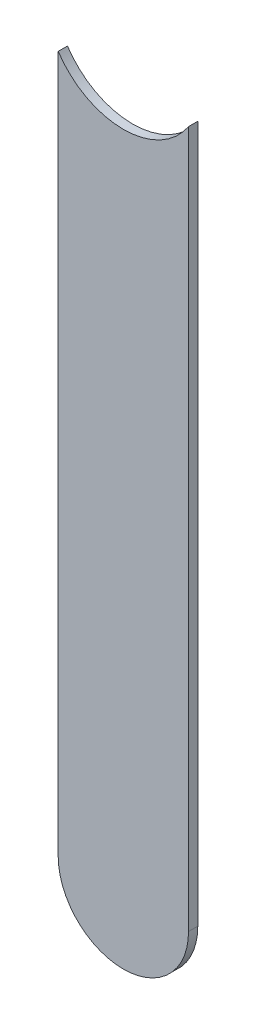
ISO-10303-21;
HEADER;
FILE_DESCRIPTION(('STEP AP214'),'2;1');
FILE_NAME('part.step','',(''),(''),'','','');
FILE_SCHEMA(('AUTOMOTIVE_DESIGN { 1 0 10303 214 1 1 1 1 }'));
ENDSEC;
DATA;
#1=APPLICATION_CONTEXT('core data for automotive mechanical design processes');
#2=APPLICATION_PROTOCOL_DEFINITION('international standard','automotive_design',2000,#1);
#3=PRODUCT_CONTEXT('',#1,'mechanical');
#4=PRODUCT('Part','Part','',(#3));
#5=PRODUCT_RELATED_PRODUCT_CATEGORY('part','',(#4));
#6=PRODUCT_DEFINITION_FORMATION('','',#4);
#7=PRODUCT_DEFINITION_CONTEXT('part definition',#1,'design');
#8=PRODUCT_DEFINITION('design','',#6,#7);
#9=PRODUCT_DEFINITION_SHAPE('','',#8);
#10=(LENGTH_UNIT() NAMED_UNIT(*) SI_UNIT(.MILLI.,.METRE.));
#11=(NAMED_UNIT(*) PLANE_ANGLE_UNIT() SI_UNIT($,.RADIAN.));
#12=(NAMED_UNIT(*) SI_UNIT($,.STERADIAN.) SOLID_ANGLE_UNIT());
#13=UNCERTAINTY_MEASURE_WITH_UNIT(LENGTH_MEASURE(1.E-05),#10,'distance_accuracy_value','');
#14=(GEOMETRIC_REPRESENTATION_CONTEXT(3) GLOBAL_UNCERTAINTY_ASSIGNED_CONTEXT((#13)) GLOBAL_UNIT_ASSIGNED_CONTEXT((#10,
#11,#12)) REPRESENTATION_CONTEXT('',''));
#15=CARTESIAN_POINT('',(0.,0.,0.));
#16=DIRECTION('',(0.,0.,1.));
#17=DIRECTION('',(1.,0.,0.));
#18=AXIS2_PLACEMENT_3D('',#15,#16,#17);
#19=CARTESIAN_POINT('',(44.3499875,55.76001548,0.));
#20=DIRECTION('',(-1.,0.,0.));
#21=DIRECTION('',(0.,1.,0.));
#22=AXIS2_PLACEMENT_3D('',#19,#20,#21);
#23=PLANE('',#22);
#24=DIRECTION('',(0.,1.,0.));
#25=VECTOR('',#24,1.);
#26=CARTESIAN_POINT('',(44.3499875,55.76001548,0.03556));
#27=LINE('',#26,#25);
#28=CARTESIAN_POINT('',(44.3499875,55.76001548,0.03556));
#29=VERTEX_POINT('',#28);
#30=CARTESIAN_POINT('',(44.3499875,58.4341534921447,0.03556));
#31=VERTEX_POINT('',#30);
#32=EDGE_CURVE('E11',#29,#31,#27,.T.);
#33=ORIENTED_EDGE('',*,*,#32,.F.);
#34=DIRECTION('',(0.,0.,1.));
#35=VECTOR('',#34,1.);
#36=CARTESIAN_POINT('',(44.3499875,55.76001548,0.));
#37=LINE('',#36,#35);
#38=CARTESIAN_POINT('',(44.3499875,55.76001548,0.));
#39=VERTEX_POINT('',#38);
#40=EDGE_CURVE('E24',#39,#29,#37,.T.);
#41=ORIENTED_EDGE('',*,*,#40,.F.);
#42=DIRECTION('',(0.,1.,0.));
#43=VECTOR('',#42,1.);
#44=CARTESIAN_POINT('',(44.3499875,55.76001548,0.));
#45=LINE('',#44,#43);
#46=CARTESIAN_POINT('',(44.3499875,58.4341534921447,0.));
#47=VERTEX_POINT('',#46);
#48=EDGE_CURVE('E75',#39,#47,#45,.T.);
#49=ORIENTED_EDGE('',*,*,#48,.T.);
#50=DIRECTION('',(0.,0.,1.));
#51=VECTOR('',#50,1.);
#52=CARTESIAN_POINT('',(44.3499875,58.4341534921447,0.));
#53=LINE('',#52,#51);
#54=EDGE_CURVE('E37',#47,#31,#53,.T.);
#55=ORIENTED_EDGE('',*,*,#54,.T.);
#56=EDGE_LOOP('',(#33,#41,#49,#55));
#57=FACE_BOUND('',#56,.T.);
#58=ADVANCED_FACE('F17',(#57),#23,.F.);
#59=CARTESIAN_POINT('',(44.099988,58.5999844,0.));
#60=DIRECTION('',(0.,0.,-1.));
#61=DIRECTION('',(1.,0.,0.));
#62=AXIS2_PLACEMENT_3D('',#59,#60,#61);
#63=CYLINDRICAL_SURFACE('',#62,0.2999994);
#64=DIRECTION('',(0.,0.,1.));
#65=VECTOR('',#64,1.);
#66=CARTESIAN_POINT('',(43.8499885,58.4341534921447,0.));
#67=LINE('',#66,#65);
#68=CARTESIAN_POINT('',(43.8499885,58.4341534921447,0.));
#69=VERTEX_POINT('',#68);
#70=CARTESIAN_POINT('',(43.8499885,58.4341534921447,0.03556));
#71=VERTEX_POINT('',#70);
#72=EDGE_CURVE('E67',#69,#71,#67,.T.);
#73=ORIENTED_EDGE('',*,*,#72,.T.);
#74=CARTESIAN_POINT('',(44.099988,58.5999844,0.03556));
#75=DIRECTION('',(0.,0.,1.));
#76=DIRECTION('',(1.,0.,0.));
#77=AXIS2_PLACEMENT_3D('',#74,#75,#76);
#78=CIRCLE('',#77,0.2999994);
#79=EDGE_CURVE('E82',#71,#31,#78,.T.);
#80=ORIENTED_EDGE('',*,*,#79,.T.);
#81=ORIENTED_EDGE('',*,*,#54,.F.);
#82=CARTESIAN_POINT('',(44.099988,58.5999844,0.));
#83=DIRECTION('',(0.,0.,1.));
#84=DIRECTION('',(1.,0.,0.));
#85=AXIS2_PLACEMENT_3D('',#82,#83,#84);
#86=CIRCLE('',#85,0.2999994);
#87=EDGE_CURVE('E80',#69,#47,#86,.T.);
#88=ORIENTED_EDGE('',*,*,#87,.F.);
#89=EDGE_LOOP('',(#73,#80,#81,#88));
#90=FACE_BOUND('',#89,.T.);
#91=ADVANCED_FACE('F88',(#90),#63,.F.);
#92=CARTESIAN_POINT('',(43.8499885,58.4341534921447,0.));
#93=DIRECTION('',(1.,0.,0.));
#94=DIRECTION('',(0.,-1.,0.));
#95=AXIS2_PLACEMENT_3D('',#92,#93,#94);
#96=PLANE('',#95);
#97=DIRECTION('',(0.,-1.,0.));
#98=VECTOR('',#97,1.);
#99=CARTESIAN_POINT('',(43.8499885,58.5999844,0.03556));
#100=LINE('',#99,#98);
#101=CARTESIAN_POINT('',(43.8499885,55.76001548,0.03556));
#102=VERTEX_POINT('',#101);
#103=EDGE_CURVE('E71',#71,#102,#100,.T.);
#104=ORIENTED_EDGE('',*,*,#103,.F.);
#105=ORIENTED_EDGE('',*,*,#72,.F.);
#106=DIRECTION('',(0.,-1.,0.));
#107=VECTOR('',#106,1.);
#108=CARTESIAN_POINT('',(43.8499885,58.5999844,0.));
#109=LINE('',#108,#107);
#110=CARTESIAN_POINT('',(43.8499885,55.76001548,0.));
#111=VERTEX_POINT('',#110);
#112=EDGE_CURVE('E63',#69,#111,#109,.T.);
#113=ORIENTED_EDGE('',*,*,#112,.T.);
#114=DIRECTION('',(0.,0.,1.));
#115=VECTOR('',#114,1.);
#116=CARTESIAN_POINT('',(43.8499885,55.76001548,0.));
#117=LINE('',#116,#115);
#118=EDGE_CURVE('E53',#111,#102,#117,.T.);
#119=ORIENTED_EDGE('',*,*,#118,.T.);
#120=EDGE_LOOP('',(#104,#105,#113,#119));
#121=FACE_BOUND('',#120,.T.);
#122=ADVANCED_FACE('F66',(#121),#96,.F.);
#123=CARTESIAN_POINT('',(44.099988,55.76001548,0.));
#124=DIRECTION('',(0.,0.,-1.));
#125=DIRECTION('',(-1.,0.,0.));
#126=AXIS2_PLACEMENT_3D('',#123,#124,#125);
#127=CYLINDRICAL_SURFACE('',#126,0.249999499999999);
#128=CARTESIAN_POINT('',(44.099988,55.76001548,0.03556));
#129=DIRECTION('',(0.,0.,1.));
#130=DIRECTION('',(-1.,0.,0.));
#131=AXIS2_PLACEMENT_3D('',#128,#129,#130);
#132=CIRCLE('',#131,0.249999499999999);
#133=EDGE_CURVE('E59',#102,#29,#132,.T.);
#134=ORIENTED_EDGE('',*,*,#133,.F.);
#135=ORIENTED_EDGE('',*,*,#118,.F.);
#136=CARTESIAN_POINT('',(44.099988,55.76001548,0.));
#137=DIRECTION('',(0.,0.,1.));
#138=DIRECTION('',(-1.,0.,0.));
#139=AXIS2_PLACEMENT_3D('',#136,#137,#138);
#140=CIRCLE('',#139,0.249999499999999);
#141=EDGE_CURVE('E57',#111,#39,#140,.T.);
#142=ORIENTED_EDGE('',*,*,#141,.T.);
#143=ORIENTED_EDGE('',*,*,#40,.T.);
#144=EDGE_LOOP('',(#134,#135,#142,#143));
#145=FACE_BOUND('',#144,.T.);
#146=ADVANCED_FACE('F55',(#145),#127,.T.);
#147=CARTESIAN_POINT('',(44.3499875,55.76001548,0.));
#148=DIRECTION('',(0.,0.,-1.));
#149=DIRECTION('',(-1.,0.,0.));
#150=AXIS2_PLACEMENT_3D('',#147,#148,#149);
#151=PLANE('',#150);
#152=ORIENTED_EDGE('',*,*,#48,.F.);
#153=ORIENTED_EDGE('',*,*,#141,.F.);
#154=ORIENTED_EDGE('',*,*,#112,.F.);
#155=ORIENTED_EDGE('',*,*,#87,.T.);
#156=EDGE_LOOP('',(#152,#153,#154,#155));
#157=FACE_BOUND('',#156,.T.);
#158=ADVANCED_FACE('F74',(#157),#151,.T.);
#159=CARTESIAN_POINT('',(44.3499875,55.76001548,0.03556));
#160=DIRECTION('',(0.,0.,-1.));
#161=DIRECTION('',(-1.,0.,0.));
#162=AXIS2_PLACEMENT_3D('',#159,#160,#161);
#163=PLANE('',#162);
#164=ORIENTED_EDGE('',*,*,#133,.T.);
#165=ORIENTED_EDGE('',*,*,#32,.T.);
#166=ORIENTED_EDGE('',*,*,#79,.F.);
#167=ORIENTED_EDGE('',*,*,#103,.T.);
#168=EDGE_LOOP('',(#164,#165,#166,#167));
#169=FACE_BOUND('',#168,.T.);
#170=ADVANCED_FACE('F91',(#169),#163,.F.);
#171=CLOSED_SHELL('',(#58,#91,#122,#146,#158,#170));
#172=MANIFOLD_SOLID_BREP('B1',#171);
#173=ADVANCED_BREP_SHAPE_REPRESENTATION('',(#18,#172),#14);
#174=SHAPE_DEFINITION_REPRESENTATION(#9,#173);
ENDSEC;
END-ISO-10303-21;
